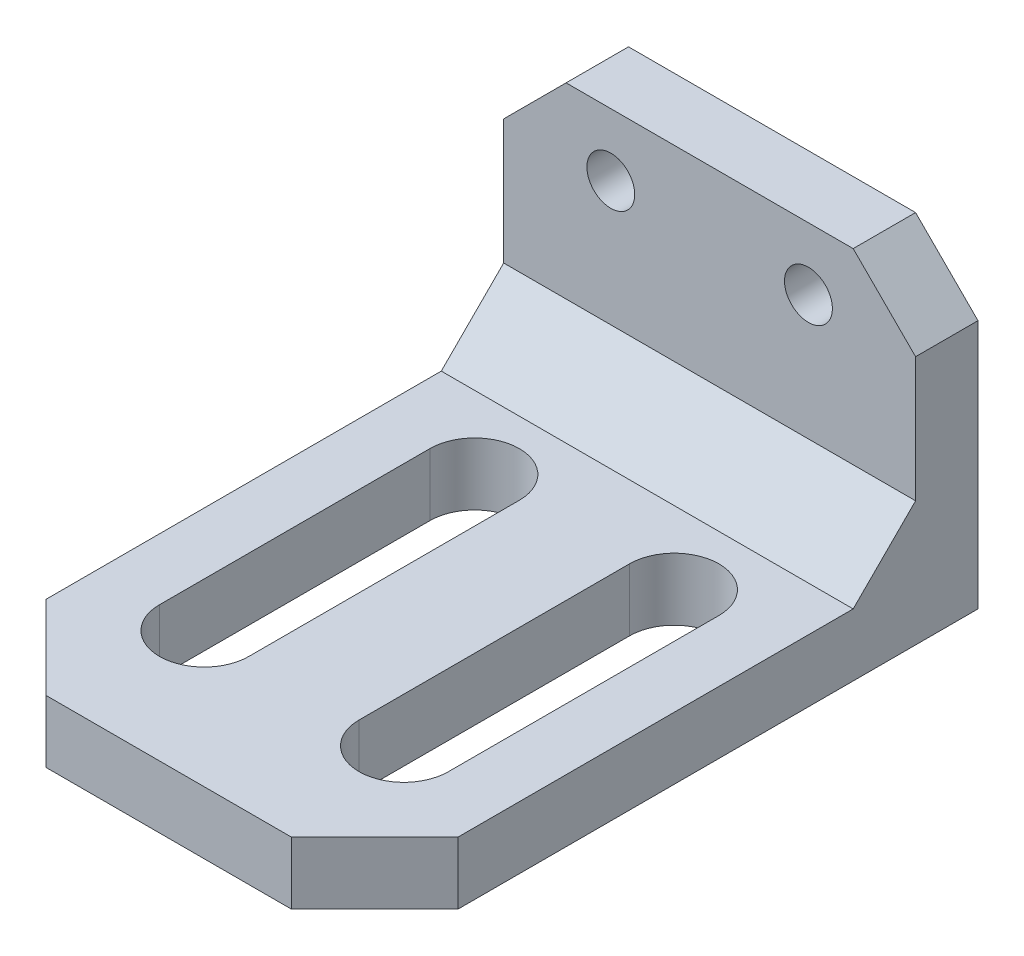
ISO-10303-21;
HEADER;
FILE_DESCRIPTION(('STEP AP214'),'2;1');
FILE_NAME('part.step','',(''),(''),'','','');
FILE_SCHEMA(('AUTOMOTIVE_DESIGN { 1 0 10303 214 1 1 1 1 }'));
ENDSEC;
DATA;
#1=APPLICATION_CONTEXT('core data for automotive mechanical design processes');
#2=APPLICATION_PROTOCOL_DEFINITION('international standard','automotive_design',2000,#1);
#3=PRODUCT_CONTEXT('',#1,'mechanical');
#4=PRODUCT('Part','Part','',(#3));
#5=PRODUCT_RELATED_PRODUCT_CATEGORY('part','',(#4));
#6=PRODUCT_DEFINITION_FORMATION('','',#4);
#7=PRODUCT_DEFINITION_CONTEXT('part definition',#1,'design');
#8=PRODUCT_DEFINITION('design','',#6,#7);
#9=PRODUCT_DEFINITION_SHAPE('','',#8);
#10=(LENGTH_UNIT() NAMED_UNIT(*) SI_UNIT(.MILLI.,.METRE.));
#11=(NAMED_UNIT(*) PLANE_ANGLE_UNIT() SI_UNIT($,.RADIAN.));
#12=(NAMED_UNIT(*) SI_UNIT($,.STERADIAN.) SOLID_ANGLE_UNIT());
#13=UNCERTAINTY_MEASURE_WITH_UNIT(LENGTH_MEASURE(1.E-05),#10,'distance_accuracy_value','');
#14=(GEOMETRIC_REPRESENTATION_CONTEXT(3) GLOBAL_UNCERTAINTY_ASSIGNED_CONTEXT((#13)) GLOBAL_UNIT_ASSIGNED_CONTEXT((#10,
#11,#12)) REPRESENTATION_CONTEXT('',''));
#15=CARTESIAN_POINT('',(0.,0.,0.));
#16=DIRECTION('',(0.,0.,1.));
#17=DIRECTION('',(1.,0.,0.));
#18=AXIS2_PLACEMENT_3D('',#15,#16,#17);
#19=CARTESIAN_POINT('',(0.,0.,3.));
#20=DIRECTION('',(0.,0.,-1.));
#21=DIRECTION('',(-1.,0.,0.));
#22=AXIS2_PLACEMENT_3D('',#19,#20,#21);
#23=PLANE('',#22);
#24=CARTESIAN_POINT('',(4.75,10.7876712328767,3.));
#25=DIRECTION('',(0.,0.,1.));
#26=DIRECTION('',(-1.,0.,0.));
#27=AXIS2_PLACEMENT_3D('',#24,#25,#26);
#28=CIRCLE('',#27,1.15);
#29=CARTESIAN_POINT('',(3.6,10.7876712328767,3.));
#30=VERTEX_POINT('',#29);
#31=EDGE_CURVE('E285',#30,#30,#28,.T.);
#32=ORIENTED_EDGE('',*,*,#31,.F.);
#33=EDGE_LOOP('',(#32));
#34=FACE_BOUND('',#33,.T.);
#35=CARTESIAN_POINT('',(-4.75,10.7876712328767,3.));
#36=DIRECTION('',(0.,0.,1.));
#37=DIRECTION('',(1.,0.,0.));
#38=AXIS2_PLACEMENT_3D('',#35,#36,#37);
#39=CIRCLE('',#38,1.15);
#40=CARTESIAN_POINT('',(-3.6,10.7876712328767,3.));
#41=VERTEX_POINT('',#40);
#42=EDGE_CURVE('E293',#41,#41,#39,.T.);
#43=ORIENTED_EDGE('',*,*,#42,.F.);
#44=EDGE_LOOP('',(#43));
#45=FACE_BOUND('',#44,.T.);
#46=DIRECTION('',(0.,1.,0.));
#47=VECTOR('',#46,1.);
#48=CARTESIAN_POINT('',(9.9,-1.21232876712329,3.));
#49=LINE('',#48,#47);
#50=CARTESIAN_POINT('',(9.9,4.78767123287671,3.));
#51=VERTEX_POINT('',#50);
#52=CARTESIAN_POINT('',(9.9,10.7876712328767,3.));
#53=VERTEX_POINT('',#52);
#54=EDGE_CURVE('E301',#51,#53,#49,.T.);
#55=ORIENTED_EDGE('',*,*,#54,.T.);
#56=DIRECTION('',(0.707106781186546,-0.707106781186549,0.));
#57=VECTOR('',#56,1.);
#58=CARTESIAN_POINT('',(6.9,13.7876712328767,3.));
#59=LINE('',#58,#57);
#60=CARTESIAN_POINT('',(6.89999999999999,13.7876712328767,3.));
#61=VERTEX_POINT('',#60);
#62=EDGE_CURVE('E356',#53,#61,#59,.F.);
#63=ORIENTED_EDGE('',*,*,#62,.T.);
#64=DIRECTION('',(-1.,0.,0.));
#65=VECTOR('',#64,1.);
#66=CARTESIAN_POINT('',(-9.9,13.7876712328767,3.));
#67=LINE('',#66,#65);
#68=CARTESIAN_POINT('',(-6.89999999999999,13.7876712328767,3.));
#69=VERTEX_POINT('',#68);
#70=EDGE_CURVE('E305',#61,#69,#67,.T.);
#71=ORIENTED_EDGE('',*,*,#70,.T.);
#72=DIRECTION('',(0.707106781186549,0.707106781186546,0.));
#73=VECTOR('',#72,1.);
#74=CARTESIAN_POINT('',(-9.9,10.7876712328767,3.));
#75=LINE('',#74,#73);
#76=CARTESIAN_POINT('',(-9.9,10.7876712328767,3.));
#77=VERTEX_POINT('',#76);
#78=EDGE_CURVE('E353',#69,#77,#75,.F.);
#79=ORIENTED_EDGE('',*,*,#78,.T.);
#80=DIRECTION('',(0.,-1.,0.));
#81=VECTOR('',#80,1.);
#82=CARTESIAN_POINT('',(-9.9,-1.21232876712329,3.));
#83=LINE('',#82,#81);
#84=CARTESIAN_POINT('',(-9.9,4.78767123287671,3.));
#85=VERTEX_POINT('',#84);
#86=EDGE_CURVE('E310',#77,#85,#83,.T.);
#87=ORIENTED_EDGE('',*,*,#86,.T.);
#88=DIRECTION('',(1.,0.,0.));
#89=VECTOR('',#88,1.);
#90=CARTESIAN_POINT('',(9.9,4.78767123287671,3.));
#91=LINE('',#90,#89);
#92=EDGE_CURVE('E350',#85,#51,#91,.T.);
#93=ORIENTED_EDGE('',*,*,#92,.T.);
#94=EDGE_LOOP('',(#55,#63,#71,#79,#87,#93));
#95=FACE_BOUND('',#94,.T.);
#96=ADVANCED_FACE('F39',(#34,#45,#95),#23,.F.);
#97=CARTESIAN_POINT('',(0.,0.,0.));
#98=DIRECTION('',(0.,0.,-1.));
#99=DIRECTION('',(-1.,0.,0.));
#100=AXIS2_PLACEMENT_3D('',#97,#98,#99);
#101=PLANE('',#100);
#102=CARTESIAN_POINT('',(-4.75,10.7876712328767,0.));
#103=DIRECTION('',(0.,0.,1.));
#104=DIRECTION('',(1.,0.,0.));
#105=AXIS2_PLACEMENT_3D('',#102,#103,#104);
#106=CIRCLE('',#105,1.15);
#107=CARTESIAN_POINT('',(-3.6,10.7876712328767,0.));
#108=VERTEX_POINT('',#107);
#109=EDGE_CURVE('E289',#108,#108,#106,.T.);
#110=ORIENTED_EDGE('',*,*,#109,.T.);
#111=EDGE_LOOP('',(#110));
#112=FACE_BOUND('',#111,.T.);
#113=DIRECTION('',(-1.,0.,0.));
#114=VECTOR('',#113,1.);
#115=CARTESIAN_POINT('',(-9.9,13.7876712328767,0.));
#116=LINE('',#115,#114);
#117=CARTESIAN_POINT('',(6.89999999999999,13.7876712328767,0.));
#118=VERTEX_POINT('',#117);
#119=CARTESIAN_POINT('',(-6.89999999999999,13.7876712328767,0.));
#120=VERTEX_POINT('',#119);
#121=EDGE_CURVE('E318',#118,#120,#116,.T.);
#122=ORIENTED_EDGE('',*,*,#121,.F.);
#123=DIRECTION('',(-0.707106781186546,0.707106781186549,0.));
#124=VECTOR('',#123,1.);
#125=CARTESIAN_POINT('',(10.3438356164384,10.3438356164383,0.));
#126=LINE('',#125,#124);
#127=CARTESIAN_POINT('',(9.9,10.7876712328767,0.));
#128=VERTEX_POINT('',#127);
#129=EDGE_CURVE('E344',#118,#128,#126,.F.);
#130=ORIENTED_EDGE('',*,*,#129,.T.);
#131=DIRECTION('',(0.,1.,0.));
#132=VECTOR('',#131,1.);
#133=CARTESIAN_POINT('',(9.9,-1.21232876712329,0.));
#134=LINE('',#133,#132);
#135=CARTESIAN_POINT('',(9.9,-1.21232876712329,0.));
#136=VERTEX_POINT('',#135);
#137=EDGE_CURVE('E297',#136,#128,#134,.T.);
#138=ORIENTED_EDGE('',*,*,#137,.F.);
#139=DIRECTION('',(1.,0.,0.));
#140=VECTOR('',#139,1.);
#141=CARTESIAN_POINT('',(-9.9,-1.21232876712329,0.));
#142=LINE('',#141,#140);
#143=CARTESIAN_POINT('',(-9.9,-1.21232876712329,0.));
#144=VERTEX_POINT('',#143);
#145=EDGE_CURVE('E306',#144,#136,#142,.T.);
#146=ORIENTED_EDGE('',*,*,#145,.F.);
#147=DIRECTION('',(0.,-1.,0.));
#148=VECTOR('',#147,1.);
#149=CARTESIAN_POINT('',(-9.9,-1.21232876712329,0.));
#150=LINE('',#149,#148);
#151=CARTESIAN_POINT('',(-9.9,10.7876712328767,0.));
#152=VERTEX_POINT('',#151);
#153=EDGE_CURVE('E322',#152,#144,#150,.T.);
#154=ORIENTED_EDGE('',*,*,#153,.F.);
#155=DIRECTION('',(-0.707106781186549,-0.707106781186546,0.));
#156=VECTOR('',#155,1.);
#157=CARTESIAN_POINT('',(-10.3438356164383,10.3438356164384,0.));
#158=LINE('',#157,#156);
#159=EDGE_CURVE('E341',#152,#120,#158,.F.);
#160=ORIENTED_EDGE('',*,*,#159,.T.);
#161=EDGE_LOOP('',(#122,#130,#138,#146,#154,#160));
#162=FACE_BOUND('',#161,.T.);
#163=CARTESIAN_POINT('',(4.75,10.7876712328767,0.));
#164=DIRECTION('',(0.,0.,1.));
#165=DIRECTION('',(-1.,0.,0.));
#166=AXIS2_PLACEMENT_3D('',#163,#164,#165);
#167=CIRCLE('',#166,1.15);
#168=CARTESIAN_POINT('',(3.6,10.7876712328767,0.));
#169=VERTEX_POINT('',#168);
#170=EDGE_CURVE('E284',#169,#169,#167,.T.);
#171=ORIENTED_EDGE('',*,*,#170,.T.);
#172=EDGE_LOOP('',(#171));
#173=FACE_BOUND('',#172,.T.);
#174=ADVANCED_FACE('F421',(#112,#162,#173),#101,.T.);
#175=CARTESIAN_POINT('',(9.9,-1.21232876712329,3.));
#176=DIRECTION('',(-1.,0.,0.));
#177=DIRECTION('',(0.,-1.,0.));
#178=AXIS2_PLACEMENT_3D('',#175,#176,#177);
#179=PLANE('',#178);
#180=DIRECTION('',(0.,0.,-1.));
#181=VECTOR('',#180,1.);
#182=CARTESIAN_POINT('',(9.9,1.78767123287671,29.));
#183=LINE('',#182,#181);
#184=CARTESIAN_POINT('',(9.9,1.78767123287671,25.));
#185=VERTEX_POINT('',#184);
#186=CARTESIAN_POINT('',(9.9,1.78767123287671,6.00000000000003));
#187=VERTEX_POINT('',#186);
#188=EDGE_CURVE('E281',#185,#187,#183,.T.);
#189=ORIENTED_EDGE('',*,*,#188,.F.);
#190=DIRECTION('',(0.,-1.,0.));
#191=VECTOR('',#190,1.);
#192=CARTESIAN_POINT('',(9.9,-1.21232876712329,25.));
#193=LINE('',#192,#191);
#194=CARTESIAN_POINT('',(9.9,-1.21232876712329,25.));
#195=VERTEX_POINT('',#194);
#196=EDGE_CURVE('E63',#185,#195,#193,.T.);
#197=ORIENTED_EDGE('',*,*,#196,.T.);
#198=DIRECTION('',(0.,0.,-1.));
#199=VECTOR('',#198,1.);
#200=CARTESIAN_POINT('',(9.9,-1.21232876712329,3.));
#201=LINE('',#200,#199);
#202=EDGE_CURVE('E314',#195,#136,#201,.T.);
#203=ORIENTED_EDGE('',*,*,#202,.T.);
#204=ORIENTED_EDGE('',*,*,#137,.T.);
#205=DIRECTION('',(0.,0.,1.));
#206=VECTOR('',#205,1.);
#207=CARTESIAN_POINT('',(9.9,10.7876712328767,3.));
#208=LINE('',#207,#206);
#209=EDGE_CURVE('E347',#128,#53,#208,.T.);
#210=ORIENTED_EDGE('',*,*,#209,.T.);
#211=ORIENTED_EDGE('',*,*,#54,.F.);
#212=DIRECTION('',(0.,0.707106781186544,-0.707106781186551));
#213=VECTOR('',#212,1.);
#214=CARTESIAN_POINT('',(9.9,1.78767123287674,6.));
#215=LINE('',#214,#213);
#216=EDGE_CURVE('E370',#51,#187,#215,.F.);
#217=ORIENTED_EDGE('',*,*,#216,.T.);
#218=EDGE_LOOP('',(#189,#197,#203,#204,#210,#211,#217));
#219=FACE_BOUND('',#218,.T.);
#220=ADVANCED_FACE('F402',(#219),#179,.F.);
#221=CARTESIAN_POINT('',(-9.9,13.7876712328767,3.));
#222=DIRECTION('',(0.,-1.,0.));
#223=DIRECTION('',(0.,0.,-1.));
#224=AXIS2_PLACEMENT_3D('',#221,#222,#223);
#225=PLANE('',#224);
#226=ORIENTED_EDGE('',*,*,#70,.F.);
#227=DIRECTION('',(0.,0.,-1.));
#228=VECTOR('',#227,1.);
#229=CARTESIAN_POINT('',(6.9,13.7876712328767,3.));
#230=LINE('',#229,#228);
#231=EDGE_CURVE('E337',#61,#118,#230,.T.);
#232=ORIENTED_EDGE('',*,*,#231,.T.);
#233=ORIENTED_EDGE('',*,*,#121,.T.);
#234=DIRECTION('',(0.,0.,1.));
#235=VECTOR('',#234,1.);
#236=CARTESIAN_POINT('',(-6.89999999999999,13.7876712328767,3.));
#237=LINE('',#236,#235);
#238=EDGE_CURVE('E334',#120,#69,#237,.T.);
#239=ORIENTED_EDGE('',*,*,#238,.T.);
#240=EDGE_LOOP('',(#226,#232,#233,#239));
#241=FACE_BOUND('',#240,.T.);
#242=ADVANCED_FACE('F432',(#241),#225,.F.);
#243=CARTESIAN_POINT('',(-9.9,-1.21232876712329,3.));
#244=DIRECTION('',(1.,0.,0.));
#245=DIRECTION('',(0.,0.,-1.));
#246=AXIS2_PLACEMENT_3D('',#243,#244,#245);
#247=PLANE('',#246);
#248=DIRECTION('',(0.,0.,-1.));
#249=VECTOR('',#248,1.);
#250=CARTESIAN_POINT('',(-9.9,-1.21232876712329,3.));
#251=LINE('',#250,#249);
#252=CARTESIAN_POINT('',(-9.9,-1.21232876712329,25.));
#253=VERTEX_POINT('',#252);
#254=EDGE_CURVE('E331',#253,#144,#251,.T.);
#255=ORIENTED_EDGE('',*,*,#254,.F.);
#256=DIRECTION('',(0.,1.,0.));
#257=VECTOR('',#256,1.);
#258=CARTESIAN_POINT('',(-9.9,-1.21232876712329,25.));
#259=LINE('',#258,#257);
#260=CARTESIAN_POINT('',(-9.9,1.78767123287671,25.));
#261=VERTEX_POINT('',#260);
#262=EDGE_CURVE('E11',#253,#261,#259,.T.);
#263=ORIENTED_EDGE('',*,*,#262,.T.);
#264=DIRECTION('',(0.,0.,-1.));
#265=VECTOR('',#264,1.);
#266=CARTESIAN_POINT('',(-9.9,1.78767123287671,29.));
#267=LINE('',#266,#265);
#268=CARTESIAN_POINT('',(-9.9,1.78767123287671,6.00000000000003));
#269=VERTEX_POINT('',#268);
#270=EDGE_CURVE('E278',#261,#269,#267,.T.);
#271=ORIENTED_EDGE('',*,*,#270,.T.);
#272=DIRECTION('',(0.,-0.707106781186544,0.707106781186551));
#273=VECTOR('',#272,1.);
#274=CARTESIAN_POINT('',(-9.9,1.78767123287674,6.));
#275=LINE('',#274,#273);
#276=EDGE_CURVE('E367',#269,#85,#275,.F.);
#277=ORIENTED_EDGE('',*,*,#276,.T.);
#278=ORIENTED_EDGE('',*,*,#86,.F.);
#279=DIRECTION('',(0.,0.,-1.));
#280=VECTOR('',#279,1.);
#281=CARTESIAN_POINT('',(-9.9,10.7876712328767,3.));
#282=LINE('',#281,#280);
#283=EDGE_CURVE('E359',#77,#152,#282,.T.);
#284=ORIENTED_EDGE('',*,*,#283,.T.);
#285=ORIENTED_EDGE('',*,*,#153,.T.);
#286=EDGE_LOOP('',(#255,#263,#271,#277,#278,#284,#285));
#287=FACE_BOUND('',#286,.T.);
#288=ADVANCED_FACE('F415',(#287),#247,.F.);
#289=CARTESIAN_POINT('',(-9.9,-1.21232876712329,3.));
#290=DIRECTION('',(0.,1.,0.));
#291=DIRECTION('',(-1.,0.,0.));
#292=AXIS2_PLACEMENT_3D('',#289,#290,#291);
#293=PLANE('',#292);
#294=DIRECTION('',(0.,0.,1.));
#295=VECTOR('',#294,1.);
#296=CARTESIAN_POINT('',(2.64705882352941,-1.21232876712329,3.));
#297=LINE('',#296,#295);
#298=CARTESIAN_POINT('',(2.64705882352941,-1.21232876712329,9.5));
#299=VERTEX_POINT('',#298);
#300=CARTESIAN_POINT('',(2.64705882352941,-1.21232876712329,22.5));
#301=VERTEX_POINT('',#300);
#302=EDGE_CURVE('E262',#299,#301,#297,.T.);
#303=ORIENTED_EDGE('',*,*,#302,.T.);
#304=CARTESIAN_POINT('',(4.79705882352941,-1.21232876712329,22.5));
#305=DIRECTION('',(0.,1.,0.));
#306=DIRECTION('',(-1.,0.,0.));
#307=AXIS2_PLACEMENT_3D('',#304,#305,#306);
#308=CIRCLE('',#307,2.15);
#309=CARTESIAN_POINT('',(6.9470588235294,-1.21232876712329,22.5));
#310=VERTEX_POINT('',#309);
#311=EDGE_CURVE('E266',#301,#310,#308,.T.);
#312=ORIENTED_EDGE('',*,*,#311,.T.);
#313=DIRECTION('',(0.,0.,-1.));
#314=VECTOR('',#313,1.);
#315=CARTESIAN_POINT('',(6.9470588235294,-1.21232876712329,3.));
#316=LINE('',#315,#314);
#317=CARTESIAN_POINT('',(6.9470588235294,-1.21232876712329,9.5));
#318=VERTEX_POINT('',#317);
#319=EDGE_CURVE('E257',#310,#318,#316,.T.);
#320=ORIENTED_EDGE('',*,*,#319,.T.);
#321=CARTESIAN_POINT('',(4.7970588235294,-1.21232876712329,9.5));
#322=DIRECTION('',(0.,1.,0.));
#323=DIRECTION('',(-1.,0.,0.));
#324=AXIS2_PLACEMENT_3D('',#321,#322,#323);
#325=CIRCLE('',#324,2.15);
#326=EDGE_CURVE('E179',#318,#299,#325,.T.);
#327=ORIENTED_EDGE('',*,*,#326,.T.);
#328=EDGE_LOOP('',(#303,#312,#320,#327));
#329=FACE_BOUND('',#328,.T.);
#330=DIRECTION('',(0.,0.,1.));
#331=VECTOR('',#330,1.);
#332=CARTESIAN_POINT('',(-6.94705882352942,-1.21232876712329,3.));
#333=LINE('',#332,#331);
#334=CARTESIAN_POINT('',(-6.94705882352942,-1.21232876712329,9.5));
#335=VERTEX_POINT('',#334);
#336=CARTESIAN_POINT('',(-6.94705882352942,-1.21232876712329,22.5));
#337=VERTEX_POINT('',#336);
#338=EDGE_CURVE('E249',#335,#337,#333,.T.);
#339=ORIENTED_EDGE('',*,*,#338,.T.);
#340=CARTESIAN_POINT('',(-4.79705882352942,-1.21232876712329,22.5));
#341=DIRECTION('',(0.,1.,0.));
#342=DIRECTION('',(-1.,0.,0.));
#343=AXIS2_PLACEMENT_3D('',#340,#341,#342);
#344=CIRCLE('',#343,2.15);
#345=CARTESIAN_POINT('',(-2.64705882352942,-1.21232876712329,22.5));
#346=VERTEX_POINT('',#345);
#347=EDGE_CURVE('E253',#337,#346,#344,.T.);
#348=ORIENTED_EDGE('',*,*,#347,.T.);
#349=DIRECTION('',(0.,0.,-1.));
#350=VECTOR('',#349,1.);
#351=CARTESIAN_POINT('',(-2.64705882352942,-1.21232876712329,3.));
#352=LINE('',#351,#350);
#353=CARTESIAN_POINT('',(-2.64705882352942,-1.21232876712329,9.5));
#354=VERTEX_POINT('',#353);
#355=EDGE_CURVE('E209',#346,#354,#352,.T.);
#356=ORIENTED_EDGE('',*,*,#355,.T.);
#357=CARTESIAN_POINT('',(-4.79705882352942,-1.21232876712329,9.5));
#358=DIRECTION('',(0.,1.,0.));
#359=DIRECTION('',(-1.,0.,0.));
#360=AXIS2_PLACEMENT_3D('',#357,#358,#359);
#361=CIRCLE('',#360,2.15);
#362=EDGE_CURVE('E245',#354,#335,#361,.T.);
#363=ORIENTED_EDGE('',*,*,#362,.T.);
#364=EDGE_LOOP('',(#339,#348,#356,#363));
#365=FACE_BOUND('',#364,.T.);
#366=ORIENTED_EDGE('',*,*,#202,.F.);
#367=DIRECTION('',(0.707106781186546,0.,-0.707106781186549));
#368=VECTOR('',#367,1.);
#369=CARTESIAN_POINT('',(5.9,-1.21232876712329,29.));
#370=LINE('',#369,#368);
#371=CARTESIAN_POINT('',(5.9,-1.21232876712329,29.));
#372=VERTEX_POINT('',#371);
#373=EDGE_CURVE('E48',#195,#372,#370,.F.);
#374=ORIENTED_EDGE('',*,*,#373,.T.);
#375=DIRECTION('',(1.,0.,0.));
#376=VECTOR('',#375,1.);
#377=CARTESIAN_POINT('',(-9.9,-1.21232876712329,29.));
#378=LINE('',#377,#376);
#379=CARTESIAN_POINT('',(-5.90000000000001,-1.21232876712329,29.));
#380=VERTEX_POINT('',#379);
#381=EDGE_CURVE('E270',#380,#372,#378,.T.);
#382=ORIENTED_EDGE('',*,*,#381,.F.);
#383=DIRECTION('',(0.707106781186546,0.,0.707106781186549));
#384=VECTOR('',#383,1.);
#385=CARTESIAN_POINT('',(-5.90000000000001,-1.21232876712329,29.));
#386=LINE('',#385,#384);
#387=EDGE_CURVE('E55',#380,#253,#386,.F.);
#388=ORIENTED_EDGE('',*,*,#387,.T.);
#389=ORIENTED_EDGE('',*,*,#254,.T.);
#390=ORIENTED_EDGE('',*,*,#145,.T.);
#391=EDGE_LOOP('',(#366,#374,#382,#388,#389,#390));
#392=FACE_BOUND('',#391,.T.);
#393=ADVANCED_FACE('F393',(#329,#365,#392),#293,.F.);
#394=CARTESIAN_POINT('',(-4.75,10.7876712328767,3.));
#395=DIRECTION('',(0.,0.,-1.));
#396=DIRECTION('',(-1.,0.,0.));
#397=AXIS2_PLACEMENT_3D('',#394,#395,#396);
#398=CYLINDRICAL_SURFACE('',#397,1.15);
#399=ORIENTED_EDGE('',*,*,#42,.T.);
#400=EDGE_LOOP('',(#399));
#401=FACE_BOUND('',#400,.T.);
#402=ORIENTED_EDGE('',*,*,#109,.F.);
#403=EDGE_LOOP('',(#402));
#404=FACE_BOUND('',#403,.T.);
#405=ADVANCED_FACE('F458',(#401,#404),#398,.F.);
#406=CARTESIAN_POINT('',(4.75,10.7876712328767,3.));
#407=DIRECTION('',(0.,0.,-1.));
#408=DIRECTION('',(-1.,0.,0.));
#409=AXIS2_PLACEMENT_3D('',#406,#407,#408);
#410=CYLINDRICAL_SURFACE('',#409,1.15);
#411=ORIENTED_EDGE('',*,*,#31,.T.);
#412=EDGE_LOOP('',(#411));
#413=FACE_BOUND('',#412,.T.);
#414=ORIENTED_EDGE('',*,*,#170,.F.);
#415=EDGE_LOOP('',(#414));
#416=FACE_BOUND('',#415,.T.);
#417=ADVANCED_FACE('F494',(#413,#416),#410,.F.);
#418=CARTESIAN_POINT('',(-9.9,1.78767123287671,29.));
#419=DIRECTION('',(0.,-1.,0.));
#420=DIRECTION('',(0.,0.,-1.));
#421=AXIS2_PLACEMENT_3D('',#418,#419,#420);
#422=PLANE('',#421);
#423=DIRECTION('',(0.,0.,-1.));
#424=VECTOR('',#423,1.);
#425=CARTESIAN_POINT('',(6.9470588235294,1.78767123287671,22.5));
#426=LINE('',#425,#424);
#427=CARTESIAN_POINT('',(6.9470588235294,1.78767123287671,22.5));
#428=VERTEX_POINT('',#427);
#429=CARTESIAN_POINT('',(6.9470588235294,1.78767123287671,9.5));
#430=VERTEX_POINT('',#429);
#431=EDGE_CURVE('E188',#428,#430,#426,.T.);
#432=ORIENTED_EDGE('',*,*,#431,.F.);
#433=CARTESIAN_POINT('',(4.79705882352941,1.78767123287671,22.5));
#434=DIRECTION('',(0.,1.,0.));
#435=DIRECTION('',(0.,0.,1.));
#436=AXIS2_PLACEMENT_3D('',#433,#434,#435);
#437=CIRCLE('',#436,2.15);
#438=CARTESIAN_POINT('',(2.64705882352941,1.78767123287671,22.5));
#439=VERTEX_POINT('',#438);
#440=EDGE_CURVE('E194',#439,#428,#437,.T.);
#441=ORIENTED_EDGE('',*,*,#440,.F.);
#442=DIRECTION('',(0.,0.,1.));
#443=VECTOR('',#442,1.);
#444=CARTESIAN_POINT('',(2.64705882352941,1.78767123287671,22.5));
#445=LINE('',#444,#443);
#446=CARTESIAN_POINT('',(2.64705882352941,1.78767123287671,9.5));
#447=VERTEX_POINT('',#446);
#448=EDGE_CURVE('E199',#447,#439,#445,.T.);
#449=ORIENTED_EDGE('',*,*,#448,.F.);
#450=CARTESIAN_POINT('',(4.7970588235294,1.78767123287671,9.5));
#451=DIRECTION('',(0.,1.,0.));
#452=DIRECTION('',(0.,0.,1.));
#453=AXIS2_PLACEMENT_3D('',#450,#451,#452);
#454=CIRCLE('',#453,2.15);
#455=EDGE_CURVE('E176',#430,#447,#454,.T.);
#456=ORIENTED_EDGE('',*,*,#455,.F.);
#457=EDGE_LOOP('',(#432,#441,#449,#456));
#458=FACE_BOUND('',#457,.T.);
#459=DIRECTION('',(0.,0.,-1.));
#460=VECTOR('',#459,1.);
#461=CARTESIAN_POINT('',(-2.64705882352942,1.78767123287671,22.5));
#462=LINE('',#461,#460);
#463=CARTESIAN_POINT('',(-2.64705882352942,1.78767123287671,22.5));
#464=VERTEX_POINT('',#463);
#465=CARTESIAN_POINT('',(-2.64705882352942,1.78767123287671,9.5));
#466=VERTEX_POINT('',#465);
#467=EDGE_CURVE('E217',#464,#466,#462,.T.);
#468=ORIENTED_EDGE('',*,*,#467,.F.);
#469=CARTESIAN_POINT('',(-4.79705882352942,1.78767123287671,22.5));
#470=DIRECTION('',(0.,1.,0.));
#471=DIRECTION('',(0.,0.,-1.));
#472=AXIS2_PLACEMENT_3D('',#469,#470,#471);
#473=CIRCLE('',#472,2.15);
#474=CARTESIAN_POINT('',(-6.94705882352942,1.78767123287671,22.5));
#475=VERTEX_POINT('',#474);
#476=EDGE_CURVE('E214',#475,#464,#473,.T.);
#477=ORIENTED_EDGE('',*,*,#476,.F.);
#478=DIRECTION('',(0.,0.,1.));
#479=VECTOR('',#478,1.);
#480=CARTESIAN_POINT('',(-6.94705882352942,1.78767123287671,22.5));
#481=LINE('',#480,#479);
#482=CARTESIAN_POINT('',(-6.94705882352942,1.78767123287671,9.5));
#483=VERTEX_POINT('',#482);
#484=EDGE_CURVE('E225',#483,#475,#481,.T.);
#485=ORIENTED_EDGE('',*,*,#484,.F.);
#486=CARTESIAN_POINT('',(-4.79705882352942,1.78767123287671,9.5));
#487=DIRECTION('',(0.,1.,0.));
#488=DIRECTION('',(0.,0.,-1.));
#489=AXIS2_PLACEMENT_3D('',#486,#487,#488);
#490=CIRCLE('',#489,2.15);
#491=EDGE_CURVE('E221',#466,#483,#490,.T.);
#492=ORIENTED_EDGE('',*,*,#491,.F.);
#493=EDGE_LOOP('',(#468,#477,#485,#492));
#494=FACE_BOUND('',#493,.T.);
#495=DIRECTION('',(-1.,0.,0.));
#496=VECTOR('',#495,1.);
#497=CARTESIAN_POINT('',(-9.9,1.78767123287671,29.));
#498=LINE('',#497,#496);
#499=CARTESIAN_POINT('',(5.9,1.78767123287671,29.));
#500=VERTEX_POINT('',#499);
#501=CARTESIAN_POINT('',(-5.90000000000001,1.78767123287671,29.));
#502=VERTEX_POINT('',#501);
#503=EDGE_CURVE('E274',#500,#502,#498,.T.);
#504=ORIENTED_EDGE('',*,*,#503,.F.);
#505=DIRECTION('',(-0.707106781186546,0.,0.707106781186549));
#506=VECTOR('',#505,1.);
#507=CARTESIAN_POINT('',(5.9,1.78767123287671,29.));
#508=LINE('',#507,#506);
#509=EDGE_CURVE('E385',#500,#185,#508,.F.);
#510=ORIENTED_EDGE('',*,*,#509,.T.);
#511=ORIENTED_EDGE('',*,*,#188,.T.);
#512=DIRECTION('',(-1.,0.,0.));
#513=VECTOR('',#512,1.);
#514=CARTESIAN_POINT('',(-9.9,1.78767123287671,6.00000000000002));
#515=LINE('',#514,#513);
#516=EDGE_CURVE('E363',#187,#269,#515,.T.);
#517=ORIENTED_EDGE('',*,*,#516,.T.);
#518=ORIENTED_EDGE('',*,*,#270,.F.);
#519=DIRECTION('',(-0.707106781186546,0.,-0.707106781186549));
#520=VECTOR('',#519,1.);
#521=CARTESIAN_POINT('',(-5.90000000000001,1.78767123287671,29.));
#522=LINE('',#521,#520);
#523=EDGE_CURVE('E382',#261,#502,#522,.F.);
#524=ORIENTED_EDGE('',*,*,#523,.T.);
#525=EDGE_LOOP('',(#504,#510,#511,#517,#518,#524));
#526=FACE_BOUND('',#525,.T.);
#527=ADVANCED_FACE('F196',(#458,#494,#526),#422,.F.);
#528=CARTESIAN_POINT('',(0.,0.,29.));
#529=DIRECTION('',(0.,0.,-1.));
#530=DIRECTION('',(-1.,0.,0.));
#531=AXIS2_PLACEMENT_3D('',#528,#529,#530);
#532=PLANE('',#531);
#533=ORIENTED_EDGE('',*,*,#381,.T.);
#534=DIRECTION('',(0.,1.,0.));
#535=VECTOR('',#534,1.);
#536=CARTESIAN_POINT('',(5.9,0.,29.));
#537=LINE('',#536,#535);
#538=EDGE_CURVE('E378',#372,#500,#537,.T.);
#539=ORIENTED_EDGE('',*,*,#538,.T.);
#540=ORIENTED_EDGE('',*,*,#503,.T.);
#541=DIRECTION('',(0.,-1.,0.));
#542=VECTOR('',#541,1.);
#543=CARTESIAN_POINT('',(-5.90000000000001,0.,29.));
#544=LINE('',#543,#542);
#545=EDGE_CURVE('E374',#502,#380,#544,.T.);
#546=ORIENTED_EDGE('',*,*,#545,.T.);
#547=EDGE_LOOP('',(#533,#539,#540,#546));
#548=FACE_BOUND('',#547,.T.);
#549=ADVANCED_FACE('F397',(#548),#532,.F.);
#550=CARTESIAN_POINT('',(6.9,13.7876712328767,3.));
#551=DIRECTION('',(-0.707106781186549,-0.707106781186546,0.));
#552=DIRECTION('',(0.,0.,-1.));
#553=AXIS2_PLACEMENT_3D('',#550,#551,#552);
#554=PLANE('',#553);
#555=ORIENTED_EDGE('',*,*,#62,.F.);
#556=ORIENTED_EDGE('',*,*,#209,.F.);
#557=ORIENTED_EDGE('',*,*,#129,.F.);
#558=ORIENTED_EDGE('',*,*,#231,.F.);
#559=EDGE_LOOP('',(#555,#556,#557,#558));
#560=FACE_BOUND('',#559,.T.);
#561=ADVANCED_FACE('F426',(#560),#554,.F.);
#562=CARTESIAN_POINT('',(-9.9,10.7876712328767,3.));
#563=DIRECTION('',(0.707106781186546,-0.707106781186549,0.));
#564=DIRECTION('',(0.,0.,-1.));
#565=AXIS2_PLACEMENT_3D('',#562,#563,#564);
#566=PLANE('',#565);
#567=ORIENTED_EDGE('',*,*,#78,.F.);
#568=ORIENTED_EDGE('',*,*,#238,.F.);
#569=ORIENTED_EDGE('',*,*,#159,.F.);
#570=ORIENTED_EDGE('',*,*,#283,.F.);
#571=EDGE_LOOP('',(#567,#568,#569,#570));
#572=FACE_BOUND('',#571,.T.);
#573=ADVANCED_FACE('F435',(#572),#566,.F.);
#574=CARTESIAN_POINT('',(-9.9,1.78767123287671,6.00000000000002));
#575=DIRECTION('',(0.,0.707106781186551,0.707106781186544));
#576=DIRECTION('',(1.,0.,0.));
#577=AXIS2_PLACEMENT_3D('',#574,#575,#576);
#578=PLANE('',#577);
#579=ORIENTED_EDGE('',*,*,#216,.F.);
#580=ORIENTED_EDGE('',*,*,#92,.F.);
#581=ORIENTED_EDGE('',*,*,#276,.F.);
#582=ORIENTED_EDGE('',*,*,#516,.F.);
#583=EDGE_LOOP('',(#579,#580,#581,#582));
#584=FACE_BOUND('',#583,.T.);
#585=ADVANCED_FACE('F409',(#584),#578,.T.);
#586=CARTESIAN_POINT('',(-4.79705882352942,-13.2123287671233,22.5));
#587=DIRECTION('',(0.,1.,0.));
#588=DIRECTION('',(0.,0.,1.));
#589=AXIS2_PLACEMENT_3D('',#586,#587,#588);
#590=CYLINDRICAL_SURFACE('',#589,2.15);
#591=DIRECTION('',(0.,1.,0.));
#592=VECTOR('',#591,1.);
#593=CARTESIAN_POINT('',(-6.94705882352942,-13.2123287671233,22.5));
#594=LINE('',#593,#592);
#595=EDGE_CURVE('E230',#337,#475,#594,.T.);
#596=ORIENTED_EDGE('',*,*,#595,.T.);
#597=ORIENTED_EDGE('',*,*,#476,.T.);
#598=DIRECTION('',(0.,1.,0.));
#599=VECTOR('',#598,1.);
#600=CARTESIAN_POINT('',(-2.64705882352942,-13.2123287671233,22.5));
#601=LINE('',#600,#599);
#602=EDGE_CURVE('E229',#346,#464,#601,.T.);
#603=ORIENTED_EDGE('',*,*,#602,.F.);
#604=ORIENTED_EDGE('',*,*,#347,.F.);
#605=EDGE_LOOP('',(#596,#597,#603,#604));
#606=FACE_BOUND('',#605,.T.);
#607=ADVANCED_FACE('F444',(#606),#590,.F.);
#608=CARTESIAN_POINT('',(-6.94705882352942,-13.2123287671233,22.5));
#609=DIRECTION('',(-1.,0.,0.));
#610=DIRECTION('',(0.,0.,1.));
#611=AXIS2_PLACEMENT_3D('',#608,#609,#610);
#612=PLANE('',#611);
#613=DIRECTION('',(0.,1.,0.));
#614=VECTOR('',#613,1.);
#615=CARTESIAN_POINT('',(-6.94705882352942,-13.2123287671233,9.5));
#616=LINE('',#615,#614);
#617=EDGE_CURVE('E233',#335,#483,#616,.T.);
#618=ORIENTED_EDGE('',*,*,#617,.T.);
#619=ORIENTED_EDGE('',*,*,#484,.T.);
#620=ORIENTED_EDGE('',*,*,#595,.F.);
#621=ORIENTED_EDGE('',*,*,#338,.F.);
#622=EDGE_LOOP('',(#618,#619,#620,#621));
#623=FACE_BOUND('',#622,.T.);
#624=ADVANCED_FACE('F535',(#623),#612,.F.);
#625=CARTESIAN_POINT('',(-4.79705882352942,-13.2123287671233,9.5));
#626=DIRECTION('',(0.,1.,0.));
#627=DIRECTION('',(0.,0.,1.));
#628=AXIS2_PLACEMENT_3D('',#625,#626,#627);
#629=CYLINDRICAL_SURFACE('',#628,2.15);
#630=DIRECTION('',(0.,1.,0.));
#631=VECTOR('',#630,1.);
#632=CARTESIAN_POINT('',(-2.64705882352942,-13.2123287671233,9.5));
#633=LINE('',#632,#631);
#634=EDGE_CURVE('E236',#354,#466,#633,.T.);
#635=ORIENTED_EDGE('',*,*,#634,.T.);
#636=ORIENTED_EDGE('',*,*,#491,.T.);
#637=ORIENTED_EDGE('',*,*,#617,.F.);
#638=ORIENTED_EDGE('',*,*,#362,.F.);
#639=EDGE_LOOP('',(#635,#636,#637,#638));
#640=FACE_BOUND('',#639,.T.);
#641=ADVANCED_FACE('F545',(#640),#629,.F.);
#642=CARTESIAN_POINT('',(-2.64705882352942,-13.2123287671233,22.5));
#643=DIRECTION('',(1.,0.,0.));
#644=DIRECTION('',(0.,0.,-1.));
#645=AXIS2_PLACEMENT_3D('',#642,#643,#644);
#646=PLANE('',#645);
#647=ORIENTED_EDGE('',*,*,#602,.T.);
#648=ORIENTED_EDGE('',*,*,#467,.T.);
#649=ORIENTED_EDGE('',*,*,#634,.F.);
#650=ORIENTED_EDGE('',*,*,#355,.F.);
#651=EDGE_LOOP('',(#647,#648,#649,#650));
#652=FACE_BOUND('',#651,.T.);
#653=ADVANCED_FACE('F555',(#652),#646,.F.);
#654=CARTESIAN_POINT('',(4.79705882352941,-13.2123287671233,22.5));
#655=DIRECTION('',(0.,1.,0.));
#656=DIRECTION('',(0.,0.,1.));
#657=AXIS2_PLACEMENT_3D('',#654,#655,#656);
#658=CYLINDRICAL_SURFACE('',#657,2.15);
#659=DIRECTION('',(0.,1.,0.));
#660=VECTOR('',#659,1.);
#661=CARTESIAN_POINT('',(2.64705882352941,-13.2123287671233,22.5));
#662=LINE('',#661,#660);
#663=EDGE_CURVE('E206',#301,#439,#662,.T.);
#664=ORIENTED_EDGE('',*,*,#663,.T.);
#665=ORIENTED_EDGE('',*,*,#440,.T.);
#666=DIRECTION('',(0.,1.,0.));
#667=VECTOR('',#666,1.);
#668=CARTESIAN_POINT('',(6.9470588235294,-13.2123287671233,22.5));
#669=LINE('',#668,#667);
#670=EDGE_CURVE('E184',#310,#428,#669,.T.);
#671=ORIENTED_EDGE('',*,*,#670,.F.);
#672=ORIENTED_EDGE('',*,*,#311,.F.);
#673=EDGE_LOOP('',(#664,#665,#671,#672));
#674=FACE_BOUND('',#673,.T.);
#675=ADVANCED_FACE('F565',(#674),#658,.F.);
#676=CARTESIAN_POINT('',(2.64705882352941,-13.2123287671233,22.5));
#677=DIRECTION('',(-1.,0.,0.));
#678=DIRECTION('',(0.,0.,1.));
#679=AXIS2_PLACEMENT_3D('',#676,#677,#678);
#680=PLANE('',#679);
#681=DIRECTION('',(0.,1.,0.));
#682=VECTOR('',#681,1.);
#683=CARTESIAN_POINT('',(2.64705882352941,-13.2123287671233,9.5));
#684=LINE('',#683,#682);
#685=EDGE_CURVE('E183',#299,#447,#684,.T.);
#686=ORIENTED_EDGE('',*,*,#685,.T.);
#687=ORIENTED_EDGE('',*,*,#448,.T.);
#688=ORIENTED_EDGE('',*,*,#663,.F.);
#689=ORIENTED_EDGE('',*,*,#302,.F.);
#690=EDGE_LOOP('',(#686,#687,#688,#689));
#691=FACE_BOUND('',#690,.T.);
#692=ADVANCED_FACE('F575',(#691),#680,.F.);
#693=CARTESIAN_POINT('',(4.7970588235294,-13.2123287671233,9.5));
#694=DIRECTION('',(0.,1.,0.));
#695=DIRECTION('',(0.,0.,1.));
#696=AXIS2_PLACEMENT_3D('',#693,#694,#695);
#697=CYLINDRICAL_SURFACE('',#696,2.15);
#698=DIRECTION('',(0.,1.,0.));
#699=VECTOR('',#698,1.);
#700=CARTESIAN_POINT('',(6.9470588235294,-13.2123287671233,9.5));
#701=LINE('',#700,#699);
#702=EDGE_CURVE('E171',#318,#430,#701,.T.);
#703=ORIENTED_EDGE('',*,*,#702,.T.);
#704=ORIENTED_EDGE('',*,*,#455,.T.);
#705=ORIENTED_EDGE('',*,*,#685,.F.);
#706=ORIENTED_EDGE('',*,*,#326,.F.);
#707=EDGE_LOOP('',(#703,#704,#705,#706));
#708=FACE_BOUND('',#707,.T.);
#709=ADVANCED_FACE('F173',(#708),#697,.F.);
#710=CARTESIAN_POINT('',(6.9470588235294,-13.2123287671233,22.5));
#711=DIRECTION('',(1.,0.,0.));
#712=DIRECTION('',(0.,0.,-1.));
#713=AXIS2_PLACEMENT_3D('',#710,#711,#712);
#714=PLANE('',#713);
#715=ORIENTED_EDGE('',*,*,#670,.T.);
#716=ORIENTED_EDGE('',*,*,#431,.T.);
#717=ORIENTED_EDGE('',*,*,#702,.F.);
#718=ORIENTED_EDGE('',*,*,#319,.F.);
#719=EDGE_LOOP('',(#715,#716,#717,#718));
#720=FACE_BOUND('',#719,.T.);
#721=ADVANCED_FACE('F189',(#720),#714,.F.);
#722=CARTESIAN_POINT('',(5.9,0.,29.));
#723=DIRECTION('',(-0.707106781186549,0.,-0.707106781186546));
#724=DIRECTION('',(0.,1.,0.));
#725=AXIS2_PLACEMENT_3D('',#722,#723,#724);
#726=PLANE('',#725);
#727=ORIENTED_EDGE('',*,*,#373,.F.);
#728=ORIENTED_EDGE('',*,*,#196,.F.);
#729=ORIENTED_EDGE('',*,*,#509,.F.);
#730=ORIENTED_EDGE('',*,*,#538,.F.);
#731=EDGE_LOOP('',(#727,#728,#729,#730));
#732=FACE_BOUND('',#731,.T.);
#733=ADVANCED_FACE('F400',(#732),#726,.F.);
#734=CARTESIAN_POINT('',(-5.90000000000001,0.,29.));
#735=DIRECTION('',(0.707106781186549,0.,-0.707106781186546));
#736=DIRECTION('',(0.,-1.,0.));
#737=AXIS2_PLACEMENT_3D('',#734,#735,#736);
#738=PLANE('',#737);
#739=ORIENTED_EDGE('',*,*,#523,.F.);
#740=ORIENTED_EDGE('',*,*,#262,.F.);
#741=ORIENTED_EDGE('',*,*,#387,.F.);
#742=ORIENTED_EDGE('',*,*,#545,.F.);
#743=EDGE_LOOP('',(#739,#740,#741,#742));
#744=FACE_BOUND('',#743,.T.);
#745=ADVANCED_FACE('F41',(#744),#738,.F.);
#746=CLOSED_SHELL('',(#96,#174,#220,#242,#288,#393,#405,#417,#527,#549,#561,#573,#585,#607,#624,
#641,#653,#675,#692,#709,#721,#733,#745));
#747=MANIFOLD_SOLID_BREP('B2',#746);
#748=ADVANCED_BREP_SHAPE_REPRESENTATION('',(#18,#747),#14);
#749=SHAPE_DEFINITION_REPRESENTATION(#9,#748);
ENDSEC;
END-ISO-10303-21;
